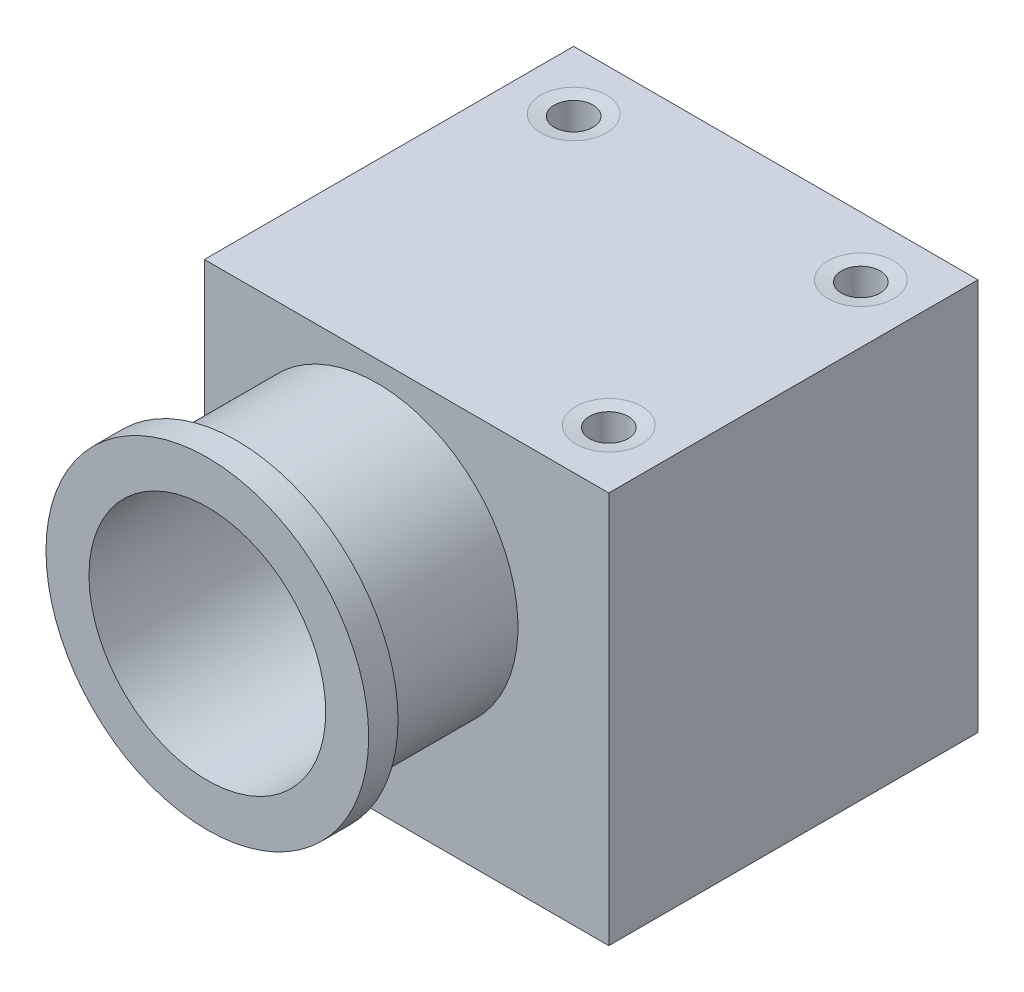
ISO-10303-21;
HEADER;
FILE_DESCRIPTION(('STEP AP214'),'2;1');
FILE_NAME('part.step','',(''),(''),'','','');
FILE_SCHEMA(('AUTOMOTIVE_DESIGN { 1 0 10303 214 1 1 1 1 }'));
ENDSEC;
DATA;
#1=APPLICATION_CONTEXT('core data for automotive mechanical design processes');
#2=APPLICATION_PROTOCOL_DEFINITION('international standard','automotive_design',2000,#1);
#3=PRODUCT_CONTEXT('',#1,'mechanical');
#4=PRODUCT('Part','Part','',(#3));
#5=PRODUCT_RELATED_PRODUCT_CATEGORY('part','',(#4));
#6=PRODUCT_DEFINITION_FORMATION('','',#4);
#7=PRODUCT_DEFINITION_CONTEXT('part definition',#1,'design');
#8=PRODUCT_DEFINITION('design','',#6,#7);
#9=PRODUCT_DEFINITION_SHAPE('','',#8);
#10=(LENGTH_UNIT() NAMED_UNIT(*) SI_UNIT(.MILLI.,.METRE.));
#11=(NAMED_UNIT(*) PLANE_ANGLE_UNIT() SI_UNIT($,.RADIAN.));
#12=(NAMED_UNIT(*) SI_UNIT($,.STERADIAN.) SOLID_ANGLE_UNIT());
#13=UNCERTAINTY_MEASURE_WITH_UNIT(LENGTH_MEASURE(1.E-05),#10,'distance_accuracy_value','');
#14=(GEOMETRIC_REPRESENTATION_CONTEXT(3) GLOBAL_UNCERTAINTY_ASSIGNED_CONTEXT((#13)) GLOBAL_UNIT_ASSIGNED_CONTEXT((#10,
#11,#12)) REPRESENTATION_CONTEXT('',''));
#15=CARTESIAN_POINT('',(0.,0.,0.));
#16=DIRECTION('',(0.,0.,1.));
#17=DIRECTION('',(1.,0.,0.));
#18=AXIS2_PLACEMENT_3D('',#15,#16,#17);
#19=CARTESIAN_POINT('',(-7.493,-8.49630000000001,-24.1554));
#20=DIRECTION('',(1.,0.,0.));
#21=DIRECTION('',(0.,0.,-1.));
#22=AXIS2_PLACEMENT_3D('',#19,#20,#21);
#23=PLANE('',#22);
#24=DIRECTION('',(0.,1.,0.));
#25=VECTOR('',#24,1.);
#26=CARTESIAN_POINT('',(-7.493,-8.49630000000001,-23.368));
#27=LINE('',#26,#25);
#28=CARTESIAN_POINT('',(-7.493,-8.49630000000001,-23.368));
#29=VERTEX_POINT('',#28);
#30=CARTESIAN_POINT('',(-7.493,8.49629999999999,-23.368));
#31=VERTEX_POINT('',#30);
#32=EDGE_CURVE('E125',#29,#31,#27,.T.);
#33=ORIENTED_EDGE('',*,*,#32,.F.);
#34=DIRECTION('',(0.,0.,1.));
#35=VECTOR('',#34,1.);
#36=CARTESIAN_POINT('',(-7.493,-8.49630000000001,-24.1554));
#37=LINE('',#36,#35);
#38=CARTESIAN_POINT('',(-7.493,-8.49630000000001,-7.366));
#39=VERTEX_POINT('',#38);
#40=EDGE_CURVE('E49',#29,#39,#37,.T.);
#41=ORIENTED_EDGE('',*,*,#40,.T.);
#42=DIRECTION('',(0.,-1.,0.));
#43=VECTOR('',#42,1.);
#44=CARTESIAN_POINT('',(-7.493,8.49629999999999,-7.366));
#45=LINE('',#44,#43);
#46=CARTESIAN_POINT('',(-7.493,8.49629999999999,-7.366));
#47=VERTEX_POINT('',#46);
#48=EDGE_CURVE('E89',#47,#39,#45,.T.);
#49=ORIENTED_EDGE('',*,*,#48,.F.);
#50=DIRECTION('',(0.,0.,1.));
#51=VECTOR('',#50,1.);
#52=CARTESIAN_POINT('',(-7.493,8.49629999999999,-24.1554));
#53=LINE('',#52,#51);
#54=EDGE_CURVE('E11',#31,#47,#53,.T.);
#55=ORIENTED_EDGE('',*,*,#54,.F.);
#56=EDGE_LOOP('',(#33,#41,#49,#55));
#57=FACE_BOUND('',#56,.T.);
#58=ADVANCED_FACE('F40',(#57),#23,.F.);
#59=CARTESIAN_POINT('',(-7.493,8.49629999999999,-24.1554));
#60=DIRECTION('',(0.,-1.,0.));
#61=DIRECTION('',(0.,0.,-1.));
#62=AXIS2_PLACEMENT_3D('',#59,#60,#61);
#63=PLANE('',#62);
#64=CARTESIAN_POINT('',(7.493,8.49629999999999,-9.906));
#65=DIRECTION('',(0.,1.,0.));
#66=DIRECTION('',(0.,0.,1.));
#67=AXIS2_PLACEMENT_3D('',#64,#65,#66);
#68=CIRCLE('',#67,1.4224);
#69=CARTESIAN_POINT('',(7.493,8.49629999999999,-8.4836));
#70=VERTEX_POINT('',#69);
#71=EDGE_CURVE('E201',#70,#70,#68,.T.);
#72=ORIENTED_EDGE('',*,*,#71,.F.);
#73=EDGE_LOOP('',(#72));
#74=FACE_BOUND('',#73,.T.);
#75=CARTESIAN_POINT('',(7.493,8.49629999999999,-20.828));
#76=DIRECTION('',(0.,1.,0.));
#77=DIRECTION('',(0.,0.,1.));
#78=AXIS2_PLACEMENT_3D('',#75,#76,#77);
#79=CIRCLE('',#78,1.4224);
#80=CARTESIAN_POINT('',(7.493,8.49629999999999,-19.4056));
#81=VERTEX_POINT('',#80);
#82=EDGE_CURVE('E190',#81,#81,#79,.T.);
#83=ORIENTED_EDGE('',*,*,#82,.F.);
#84=EDGE_LOOP('',(#83));
#85=FACE_BOUND('',#84,.T.);
#86=CARTESIAN_POINT('',(-4.953,8.49629999999999,-20.828));
#87=DIRECTION('',(0.,1.,0.));
#88=DIRECTION('',(0.,0.,1.));
#89=AXIS2_PLACEMENT_3D('',#86,#87,#88);
#90=CIRCLE('',#89,1.4224);
#91=CARTESIAN_POINT('',(-4.953,8.49629999999999,-19.4056));
#92=VERTEX_POINT('',#91);
#93=EDGE_CURVE('E118',#92,#92,#90,.T.);
#94=ORIENTED_EDGE('',*,*,#93,.F.);
#95=EDGE_LOOP('',(#94));
#96=FACE_BOUND('',#95,.T.);
#97=DIRECTION('',(1.,0.,0.));
#98=VECTOR('',#97,1.);
#99=CARTESIAN_POINT('',(-7.493,8.49629999999999,-23.368));
#100=LINE('',#99,#98);
#101=CARTESIAN_POINT('',(10.033,8.49629999999999,-23.368));
#102=VERTEX_POINT('',#101);
#103=EDGE_CURVE('E128',#31,#102,#100,.T.);
#104=ORIENTED_EDGE('',*,*,#103,.F.);
#105=ORIENTED_EDGE('',*,*,#54,.T.);
#106=DIRECTION('',(-1.,0.,0.));
#107=VECTOR('',#106,1.);
#108=CARTESIAN_POINT('',(-7.493,8.49629999999999,-7.366));
#109=LINE('',#108,#107);
#110=CARTESIAN_POINT('',(10.033,8.49629999999999,-7.366));
#111=VERTEX_POINT('',#110);
#112=EDGE_CURVE('E92',#111,#47,#109,.T.);
#113=ORIENTED_EDGE('',*,*,#112,.F.);
#114=DIRECTION('',(0.,0.,1.));
#115=VECTOR('',#114,1.);
#116=CARTESIAN_POINT('',(10.033,8.49629999999999,-7.366));
#117=LINE('',#116,#115);
#118=EDGE_CURVE('E107',#102,#111,#117,.T.);
#119=ORIENTED_EDGE('',*,*,#118,.F.);
#120=EDGE_LOOP('',(#104,#105,#113,#119));
#121=FACE_BOUND('',#120,.T.);
#122=ADVANCED_FACE('F210',(#74,#85,#96,#121),#63,.F.);
#123=CARTESIAN_POINT('',(-7.493,-8.49630000000001,-24.1554));
#124=DIRECTION('',(0.,-1.,0.));
#125=DIRECTION('',(0.,0.,-1.));
#126=AXIS2_PLACEMENT_3D('',#123,#124,#125);
#127=PLANE('',#126);
#128=CARTESIAN_POINT('',(7.493,-8.49630000000001,-9.906));
#129=DIRECTION('',(0.,-1.,0.));
#130=DIRECTION('',(0.,0.,-1.));
#131=AXIS2_PLACEMENT_3D('',#128,#129,#130);
#132=CIRCLE('',#131,0.838200000000001);
#133=CARTESIAN_POINT('',(7.493,-8.49630000000001,-10.7442));
#134=VERTEX_POINT('',#133);
#135=EDGE_CURVE('E180',#134,#134,#132,.T.);
#136=ORIENTED_EDGE('',*,*,#135,.F.);
#137=EDGE_LOOP('',(#136));
#138=FACE_BOUND('',#137,.T.);
#139=CARTESIAN_POINT('',(7.493,-8.49630000000001,-20.828));
#140=DIRECTION('',(0.,-1.,0.));
#141=DIRECTION('',(0.,0.,-1.));
#142=AXIS2_PLACEMENT_3D('',#139,#140,#141);
#143=CIRCLE('',#142,0.838200000000001);
#144=CARTESIAN_POINT('',(7.493,-8.49630000000001,-21.6662));
#145=VERTEX_POINT('',#144);
#146=EDGE_CURVE('E115',#145,#145,#143,.T.);
#147=ORIENTED_EDGE('',*,*,#146,.F.);
#148=EDGE_LOOP('',(#147));
#149=FACE_BOUND('',#148,.T.);
#150=CARTESIAN_POINT('',(-4.953,-8.49630000000001,-20.828));
#151=DIRECTION('',(0.,-1.,0.));
#152=DIRECTION('',(0.,0.,-1.));
#153=AXIS2_PLACEMENT_3D('',#150,#151,#152);
#154=CIRCLE('',#153,0.8382);
#155=CARTESIAN_POINT('',(-4.953,-8.49630000000001,-21.6662));
#156=VERTEX_POINT('',#155);
#157=EDGE_CURVE('E109',#156,#156,#154,.T.);
#158=ORIENTED_EDGE('',*,*,#157,.F.);
#159=EDGE_LOOP('',(#158));
#160=FACE_BOUND('',#159,.T.);
#161=ORIENTED_EDGE('',*,*,#40,.F.);
#162=DIRECTION('',(-1.,0.,0.));
#163=VECTOR('',#162,1.);
#164=CARTESIAN_POINT('',(-7.493,-8.49630000000001,-23.368));
#165=LINE('',#164,#163);
#166=CARTESIAN_POINT('',(10.033,-8.49630000000001,-23.368));
#167=VERTEX_POINT('',#166);
#168=EDGE_CURVE('E97',#167,#29,#165,.T.);
#169=ORIENTED_EDGE('',*,*,#168,.F.);
#170=DIRECTION('',(0.,0.,-1.));
#171=VECTOR('',#170,1.);
#172=CARTESIAN_POINT('',(10.033,-8.49630000000001,-7.366));
#173=LINE('',#172,#171);
#174=CARTESIAN_POINT('',(10.033,-8.49630000000001,-7.366));
#175=VERTEX_POINT('',#174);
#176=EDGE_CURVE('E95',#175,#167,#173,.T.);
#177=ORIENTED_EDGE('',*,*,#176,.F.);
#178=DIRECTION('',(1.,0.,0.));
#179=VECTOR('',#178,1.);
#180=CARTESIAN_POINT('',(-7.493,-8.49630000000001,-7.366));
#181=LINE('',#180,#179);
#182=EDGE_CURVE('E83',#39,#175,#181,.T.);
#183=ORIENTED_EDGE('',*,*,#182,.F.);
#184=EDGE_LOOP('',(#161,#169,#177,#183));
#185=FACE_BOUND('',#184,.T.);
#186=ADVANCED_FACE('F96',(#138,#149,#160,#185),#127,.T.);
#187=CARTESIAN_POINT('',(0.,1.50369999999999,-24.1554));
#188=DIRECTION('',(0.,0.,1.));
#189=DIRECTION('',(1.,0.,0.));
#190=AXIS2_PLACEMENT_3D('',#187,#188,#189);
#191=CYLINDRICAL_SURFACE('',#190,1.4224);
#192=CARTESIAN_POINT('',(0.,1.50369999999999,-19.558));
#193=DIRECTION('',(0.,0.,1.));
#194=DIRECTION('',(1.,0.,0.));
#195=AXIS2_PLACEMENT_3D('',#192,#193,#194);
#196=CIRCLE('',#195,1.4224);
#197=CARTESIAN_POINT('',(1.4224,1.50369999999999,-19.558));
#198=VERTEX_POINT('',#197);
#199=EDGE_CURVE('E166',#198,#198,#196,.F.);
#200=ORIENTED_EDGE('',*,*,#199,.F.);
#201=EDGE_LOOP('',(#200));
#202=FACE_BOUND('',#201,.T.);
#203=CARTESIAN_POINT('',(0.,1.50369999999999,-23.368));
#204=DIRECTION('',(0.,0.,-1.));
#205=DIRECTION('',(-1.,0.,0.));
#206=AXIS2_PLACEMENT_3D('',#203,#204,#205);
#207=CIRCLE('',#206,1.4224);
#208=CARTESIAN_POINT('',(-1.4224,1.50369999999999,-23.368));
#209=VERTEX_POINT('',#208);
#210=EDGE_CURVE('E133',#209,#209,#207,.F.);
#211=ORIENTED_EDGE('',*,*,#210,.F.);
#212=EDGE_LOOP('',(#211));
#213=FACE_BOUND('',#212,.T.);
#214=ADVANCED_FACE('F223',(#202,#213),#191,.F.);
#215=CARTESIAN_POINT('',(0.,0.,-7.366));
#216=DIRECTION('',(0.,0.,1.));
#217=DIRECTION('',(1.,0.,0.));
#218=AXIS2_PLACEMENT_3D('',#215,#216,#217);
#219=PLANE('',#218);
#220=ORIENTED_EDGE('',*,*,#48,.T.);
#221=ORIENTED_EDGE('',*,*,#182,.T.);
#222=DIRECTION('',(0.,-1.,0.));
#223=VECTOR('',#222,1.);
#224=CARTESIAN_POINT('',(10.033,8.49629999999999,-7.366));
#225=LINE('',#224,#223);
#226=EDGE_CURVE('E88',#111,#175,#225,.T.);
#227=ORIENTED_EDGE('',*,*,#226,.F.);
#228=ORIENTED_EDGE('',*,*,#112,.T.);
#229=EDGE_LOOP('',(#220,#221,#227,#228));
#230=FACE_BOUND('',#229,.T.);
#231=CARTESIAN_POINT('',(0.,1.50369999999999,-7.366));
#232=DIRECTION('',(0.,0.,1.));
#233=DIRECTION('',(1.,0.,0.));
#234=AXIS2_PLACEMENT_3D('',#231,#232,#233);
#235=CIRCLE('',#234,6.096);
#236=CARTESIAN_POINT('',(-6.096,1.50369999999999,-7.366));
#237=VERTEX_POINT('',#236);
#238=EDGE_CURVE('E143',#237,#237,#235,.T.);
#239=ORIENTED_EDGE('',*,*,#238,.F.);
#240=EDGE_LOOP('',(#239));
#241=FACE_BOUND('',#240,.T.);
#242=ADVANCED_FACE('F85',(#230,#241),#219,.T.);
#243=CARTESIAN_POINT('',(0.,1.50369999999999,-18.288));
#244=DIRECTION('',(0.,0.,1.));
#245=DIRECTION('',(1.,0.,0.));
#246=AXIS2_PLACEMENT_3D('',#243,#244,#245);
#247=CYLINDRICAL_SURFACE('',#246,5.1308);
#248=CARTESIAN_POINT('',(0.,1.50369999999999,-18.288));
#249=DIRECTION('',(0.,0.,1.));
#250=DIRECTION('',(1.,0.,0.));
#251=AXIS2_PLACEMENT_3D('',#248,#249,#250);
#252=CIRCLE('',#251,5.1308);
#253=CARTESIAN_POINT('',(5.1308,1.50369999999999,-18.288));
#254=VERTEX_POINT('',#253);
#255=EDGE_CURVE('E157',#254,#254,#252,.T.);
#256=ORIENTED_EDGE('',*,*,#255,.F.);
#257=EDGE_LOOP('',(#256));
#258=FACE_BOUND('',#257,.T.);
#259=CARTESIAN_POINT('',(0.,1.50369999999999,0.));
#260=DIRECTION('',(0.,0.,1.));
#261=DIRECTION('',(1.,0.,0.));
#262=AXIS2_PLACEMENT_3D('',#259,#260,#261);
#263=CIRCLE('',#262,5.1308);
#264=CARTESIAN_POINT('',(5.1308,1.50369999999999,0.));
#265=VERTEX_POINT('',#264);
#266=EDGE_CURVE('E134',#265,#265,#263,.T.);
#267=ORIENTED_EDGE('',*,*,#266,.T.);
#268=EDGE_LOOP('',(#267));
#269=FACE_BOUND('',#268,.T.);
#270=ADVANCED_FACE('F231',(#258,#269),#247,.F.);
#271=CARTESIAN_POINT('',(0.,1.50369999999999,-19.558));
#272=DIRECTION('',(0.,0.,1.));
#273=DIRECTION('',(1.,0.,0.));
#274=AXIS2_PLACEMENT_3D('',#271,#272,#273);
#275=CYLINDRICAL_SURFACE('',#274,3.2639);
#276=CARTESIAN_POINT('',(0.,1.50369999999999,-19.558));
#277=DIRECTION('',(0.,0.,1.));
#278=DIRECTION('',(1.,0.,0.));
#279=AXIS2_PLACEMENT_3D('',#276,#277,#278);
#280=CIRCLE('',#279,3.2639);
#281=CARTESIAN_POINT('',(3.2639,1.50369999999999,-19.558));
#282=VERTEX_POINT('',#281);
#283=EDGE_CURVE('E162',#282,#282,#280,.T.);
#284=ORIENTED_EDGE('',*,*,#283,.F.);
#285=EDGE_LOOP('',(#284));
#286=FACE_BOUND('',#285,.T.);
#287=CARTESIAN_POINT('',(0.,1.50369999999999,-18.288));
#288=DIRECTION('',(0.,0.,1.));
#289=DIRECTION('',(1.,0.,0.));
#290=AXIS2_PLACEMENT_3D('',#287,#288,#289);
#291=CIRCLE('',#290,3.2639);
#292=CARTESIAN_POINT('',(3.2639,1.50369999999999,-18.288));
#293=VERTEX_POINT('',#292);
#294=EDGE_CURVE('E161',#293,#293,#291,.F.);
#295=ORIENTED_EDGE('',*,*,#294,.F.);
#296=EDGE_LOOP('',(#295));
#297=FACE_BOUND('',#296,.T.);
#298=ADVANCED_FACE('F263',(#286,#297),#275,.F.);
#299=CARTESIAN_POINT('',(0.,1.50369999999999,-19.558));
#300=DIRECTION('',(0.,0.,1.));
#301=DIRECTION('',(1.,0.,0.));
#302=AXIS2_PLACEMENT_3D('',#299,#300,#301);
#303=PLANE('',#302);
#304=ORIENTED_EDGE('',*,*,#283,.T.);
#305=EDGE_LOOP('',(#304));
#306=FACE_BOUND('',#305,.T.);
#307=ORIENTED_EDGE('',*,*,#199,.T.);
#308=EDGE_LOOP('',(#307));
#309=FACE_BOUND('',#308,.T.);
#310=ADVANCED_FACE('F274',(#306,#309),#303,.T.);
#311=CARTESIAN_POINT('',(0.,1.50369999999999,-18.288));
#312=DIRECTION('',(0.,0.,1.));
#313=DIRECTION('',(1.,0.,0.));
#314=AXIS2_PLACEMENT_3D('',#311,#312,#313);
#315=PLANE('',#314);
#316=ORIENTED_EDGE('',*,*,#255,.T.);
#317=EDGE_LOOP('',(#316));
#318=FACE_BOUND('',#317,.T.);
#319=ORIENTED_EDGE('',*,*,#294,.T.);
#320=EDGE_LOOP('',(#319));
#321=FACE_BOUND('',#320,.T.);
#322=ADVANCED_FACE('F283',(#318,#321),#315,.T.);
#323=CARTESIAN_POINT('',(0.,1.50369999999999,-1.27));
#324=DIRECTION('',(0.,0.,-1.));
#325=DIRECTION('',(-1.,0.,0.));
#326=AXIS2_PLACEMENT_3D('',#323,#324,#325);
#327=CYLINDRICAL_SURFACE('',#326,6.096);
#328=CARTESIAN_POINT('',(0.,1.50369999999999,-1.27));
#329=DIRECTION('',(0.,0.,1.));
#330=DIRECTION('',(1.,0.,0.));
#331=AXIS2_PLACEMENT_3D('',#328,#329,#330);
#332=CIRCLE('',#331,6.096);
#333=CARTESIAN_POINT('',(-6.096,1.50369999999999,-1.27));
#334=VERTEX_POINT('',#333);
#335=EDGE_CURVE('E147',#334,#334,#332,.T.);
#336=CARTESIAN_POINT('',(-6.096,1.50369999999999,-1.27));
#337=CARTESIAN_POINT('',(-6.096,1.50369999999999,-1.3335));
#338=CARTESIAN_POINT('',(-6.096,1.50369999999999,-1.397));
#339=CARTESIAN_POINT('',(-6.096,1.50369999999999,-1.524));
#340=CARTESIAN_POINT('',(-6.096,1.50369999999999,-1.5875));
#341=CARTESIAN_POINT('',(-6.096,1.50369999999999,-1.7145));
#342=CARTESIAN_POINT('',(-6.096,1.50369999999999,-1.778));
#343=CARTESIAN_POINT('',(-6.096,1.50369999999999,-1.905));
#344=CARTESIAN_POINT('',(-6.096,1.50369999999999,-1.9685));
#345=CARTESIAN_POINT('',(-6.096,1.50369999999999,-2.0955));
#346=CARTESIAN_POINT('',(-6.096,1.50369999999999,-2.159));
#347=CARTESIAN_POINT('',(-6.096,1.50369999999999,-2.286));
#348=CARTESIAN_POINT('',(-6.096,1.50369999999999,-2.3495));
#349=CARTESIAN_POINT('',(-6.096,1.50369999999999,-2.4765));
#350=CARTESIAN_POINT('',(-6.096,1.50369999999999,-2.54));
#351=CARTESIAN_POINT('',(-6.096,1.50369999999999,-2.667));
#352=CARTESIAN_POINT('',(-6.096,1.50369999999999,-2.7305));
#353=CARTESIAN_POINT('',(-6.096,1.50369999999999,-2.8575));
#354=CARTESIAN_POINT('',(-6.096,1.50369999999999,-2.921));
#355=CARTESIAN_POINT('',(-6.096,1.50369999999999,-3.048));
#356=CARTESIAN_POINT('',(-6.096,1.50369999999999,-3.1115));
#357=CARTESIAN_POINT('',(-6.096,1.50369999999999,-3.2385));
#358=CARTESIAN_POINT('',(-6.096,1.50369999999999,-3.302));
#359=CARTESIAN_POINT('',(-6.096,1.50369999999999,-3.429));
#360=CARTESIAN_POINT('',(-6.096,1.50369999999999,-3.4925));
#361=CARTESIAN_POINT('',(-6.096,1.50369999999999,-3.6195));
#362=CARTESIAN_POINT('',(-6.096,1.50369999999999,-3.683));
#363=CARTESIAN_POINT('',(-6.096,1.50369999999999,-3.81));
#364=CARTESIAN_POINT('',(-6.096,1.50369999999999,-3.8735));
#365=CARTESIAN_POINT('',(-6.096,1.50369999999999,-4.0005));
#366=CARTESIAN_POINT('',(-6.096,1.50369999999999,-4.064));
#367=CARTESIAN_POINT('',(-6.096,1.50369999999999,-4.191));
#368=CARTESIAN_POINT('',(-6.096,1.50369999999999,-4.2545));
#369=CARTESIAN_POINT('',(-6.096,1.50369999999999,-4.3815));
#370=CARTESIAN_POINT('',(-6.096,1.50369999999999,-4.445));
#371=CARTESIAN_POINT('',(-6.096,1.50369999999999,-4.572));
#372=CARTESIAN_POINT('',(-6.096,1.50369999999999,-4.6355));
#373=CARTESIAN_POINT('',(-6.096,1.50369999999999,-4.7625));
#374=CARTESIAN_POINT('',(-6.096,1.50369999999999,-4.826));
#375=CARTESIAN_POINT('',(-6.096,1.50369999999999,-4.953));
#376=CARTESIAN_POINT('',(-6.096,1.50369999999999,-5.0165));
#377=CARTESIAN_POINT('',(-6.096,1.50369999999999,-5.1435));
#378=CARTESIAN_POINT('',(-6.096,1.50369999999999,-5.207));
#379=CARTESIAN_POINT('',(-6.096,1.50369999999999,-5.334));
#380=CARTESIAN_POINT('',(-6.096,1.50369999999999,-5.3975));
#381=CARTESIAN_POINT('',(-6.096,1.50369999999999,-5.5245));
#382=CARTESIAN_POINT('',(-6.096,1.50369999999999,-5.588));
#383=CARTESIAN_POINT('',(-6.096,1.50369999999999,-5.715));
#384=CARTESIAN_POINT('',(-6.096,1.50369999999999,-5.7785));
#385=CARTESIAN_POINT('',(-6.096,1.50369999999999,-5.9055));
#386=CARTESIAN_POINT('',(-6.096,1.50369999999999,-5.969));
#387=CARTESIAN_POINT('',(-6.096,1.50369999999999,-6.096));
#388=CARTESIAN_POINT('',(-6.096,1.50369999999999,-6.1595));
#389=CARTESIAN_POINT('',(-6.096,1.50369999999999,-6.2865));
#390=CARTESIAN_POINT('',(-6.096,1.50369999999999,-6.35));
#391=CARTESIAN_POINT('',(-6.096,1.50369999999999,-6.477));
#392=CARTESIAN_POINT('',(-6.096,1.50369999999999,-6.5405));
#393=CARTESIAN_POINT('',(-6.096,1.50369999999999,-6.6675));
#394=CARTESIAN_POINT('',(-6.096,1.50369999999999,-6.731));
#395=CARTESIAN_POINT('',(-6.096,1.50369999999999,-6.858));
#396=CARTESIAN_POINT('',(-6.096,1.50369999999999,-6.9215));
#397=CARTESIAN_POINT('',(-6.096,1.50369999999999,-7.0485));
#398=CARTESIAN_POINT('',(-6.096,1.50369999999999,-7.112));
#399=CARTESIAN_POINT('',(-6.096,1.50369999999999,-7.239));
#400=CARTESIAN_POINT('',(-6.096,1.50369999999999,-7.3025));
#401=CARTESIAN_POINT('',(-6.096,1.50369999999999,-7.366));
#402=B_SPLINE_CURVE_WITH_KNOTS('',3,(#336,#337,#338,#339,#340,#341,#342,#343,#344,#345,#346,
#347,#348,#349,#350,#351,#352,#353,#354,#355,#356,#357,#358,#359,#360,#361,#362,#363,#364,#365,
#366,#367,#368,#369,#370,#371,#372,#373,#374,#375,#376,#377,#378,#379,#380,#381,#382,#383,#384,
#385,#386,#387,#388,#389,#390,#391,#392,#393,#394,#395,#396,#397,#398,#399,#400,#401),
.UNSPECIFIED.,.F.,.F.,(4,2,2,2,2,2,2,2,2,2,2,2,2,2,2,2,2,2,2,2,2,2,2,2,2,2,2,2,2,2,2,2,4),(0.,
0.1905,0.381,0.5715,0.762,0.9525,1.143,1.3335,1.524,1.7145,1.905,2.0955,2.286,2.4765,2.667,
2.8575,3.048,3.2385,3.429,3.6195,3.81,4.0005,4.191,4.3815,4.572,4.7625,4.953,5.1435,5.334,
5.5245,5.715,5.9055,6.096),.UNSPECIFIED.);
#403=EDGE_CURVE('BSEAM291',#334,#237,#402,.T.);
#404=ORIENTED_EDGE('',*,*,#335,.F.);
#405=ORIENTED_EDGE('',*,*,#238,.T.);
#406=ORIENTED_EDGE('',*,*,#403,.T.);
#407=ORIENTED_EDGE('',*,*,#403,.F.);
#408=EDGE_LOOP('',(#404,#406,#405,#407));
#409=FACE_BOUND('',#408,.T.);
#410=ADVANCED_FACE('F291',(#409),#327,.T.);
#411=CARTESIAN_POINT('',(0.,1.50369999999999,-1.27));
#412=DIRECTION('',(0.,0.,1.));
#413=DIRECTION('',(1.,0.,0.));
#414=AXIS2_PLACEMENT_3D('',#411,#412,#413);
#415=PLANE('',#414);
#416=CARTESIAN_POINT('',(0.,1.50369999999999,-1.27));
#417=DIRECTION('',(0.,0.,1.));
#418=DIRECTION('',(1.,0.,0.));
#419=AXIS2_PLACEMENT_3D('',#416,#417,#418);
#420=CIRCLE('',#419,6.9926);
#421=CARTESIAN_POINT('',(6.9926,1.50369999999999,-1.27));
#422=VERTEX_POINT('',#421);
#423=EDGE_CURVE('E138',#422,#422,#420,.T.);
#424=ORIENTED_EDGE('',*,*,#423,.F.);
#425=EDGE_LOOP('',(#424));
#426=FACE_BOUND('',#425,.T.);
#427=ORIENTED_EDGE('',*,*,#335,.T.);
#428=EDGE_LOOP('',(#427));
#429=FACE_BOUND('',#428,.T.);
#430=ADVANCED_FACE('F299',(#426,#429),#415,.F.);
#431=CARTESIAN_POINT('',(0.,1.50369999999999,0.));
#432=DIRECTION('',(0.,0.,1.));
#433=DIRECTION('',(1.,0.,0.));
#434=AXIS2_PLACEMENT_3D('',#431,#432,#433);
#435=PLANE('',#434);
#436=CARTESIAN_POINT('',(0.,1.50369999999999,0.));
#437=DIRECTION('',(0.,0.,1.));
#438=DIRECTION('',(1.,0.,0.));
#439=AXIS2_PLACEMENT_3D('',#436,#437,#438);
#440=CIRCLE('',#439,6.9926);
#441=CARTESIAN_POINT('',(6.9926,1.50369999999999,0.));
#442=VERTEX_POINT('',#441);
#443=EDGE_CURVE('E139',#442,#442,#440,.T.);
#444=ORIENTED_EDGE('',*,*,#443,.T.);
#445=EDGE_LOOP('',(#444));
#446=FACE_BOUND('',#445,.T.);
#447=ORIENTED_EDGE('',*,*,#266,.F.);
#448=EDGE_LOOP('',(#447));
#449=FACE_BOUND('',#448,.T.);
#450=ADVANCED_FACE('F307',(#446,#449),#435,.T.);
#451=CARTESIAN_POINT('',(0.,1.50369999999999,0.));
#452=DIRECTION('',(0.,0.,-1.));
#453=DIRECTION('',(-1.,0.,0.));
#454=AXIS2_PLACEMENT_3D('',#451,#452,#453);
#455=CYLINDRICAL_SURFACE('',#454,6.9926);
#456=ORIENTED_EDGE('',*,*,#443,.F.);
#457=EDGE_LOOP('',(#456));
#458=FACE_BOUND('',#457,.T.);
#459=ORIENTED_EDGE('',*,*,#423,.T.);
#460=EDGE_LOOP('',(#459));
#461=FACE_BOUND('',#460,.T.);
#462=ADVANCED_FACE('F219',(#458,#461),#455,.T.);
#463=CARTESIAN_POINT('',(0.,0.,-23.368));
#464=DIRECTION('',(0.,0.,-1.));
#465=DIRECTION('',(-1.,0.,0.));
#466=AXIS2_PLACEMENT_3D('',#463,#464,#465);
#467=PLANE('',#466);
#468=ORIENTED_EDGE('',*,*,#32,.T.);
#469=ORIENTED_EDGE('',*,*,#103,.T.);
#470=DIRECTION('',(0.,1.,0.));
#471=VECTOR('',#470,1.);
#472=CARTESIAN_POINT('',(10.033,8.49629999999999,-23.368));
#473=LINE('',#472,#471);
#474=EDGE_CURVE('E102',#167,#102,#473,.T.);
#475=ORIENTED_EDGE('',*,*,#474,.F.);
#476=ORIENTED_EDGE('',*,*,#168,.T.);
#477=EDGE_LOOP('',(#468,#469,#475,#476));
#478=FACE_BOUND('',#477,.T.);
#479=ORIENTED_EDGE('',*,*,#210,.T.);
#480=EDGE_LOOP('',(#479));
#481=FACE_BOUND('',#480,.T.);
#482=ADVANCED_FACE('F216',(#478,#481),#467,.T.);
#483=CARTESIAN_POINT('',(10.033,0.,0.));
#484=DIRECTION('',(1.,0.,0.));
#485=DIRECTION('',(0.,0.,-1.));
#486=AXIS2_PLACEMENT_3D('',#483,#484,#485);
#487=PLANE('',#486);
#488=ORIENTED_EDGE('',*,*,#226,.T.);
#489=ORIENTED_EDGE('',*,*,#176,.T.);
#490=ORIENTED_EDGE('',*,*,#474,.T.);
#491=ORIENTED_EDGE('',*,*,#118,.T.);
#492=EDGE_LOOP('',(#488,#489,#490,#491));
#493=FACE_BOUND('',#492,.T.);
#494=ADVANCED_FACE('F105',(#493),#487,.T.);
#495=CARTESIAN_POINT('',(-4.953,-11.8237,-20.828));
#496=DIRECTION('',(0.,1.,0.));
#497=DIRECTION('',(0.,0.,1.));
#498=AXIS2_PLACEMENT_3D('',#495,#496,#497);
#499=CYLINDRICAL_SURFACE('',#498,0.8382);
#500=CARTESIAN_POINT('',(-4.953,8.41419604436686,-20.828));
#501=DIRECTION('',(0.,1.,0.));
#502=DIRECTION('',(0.,0.,1.));
#503=AXIS2_PLACEMENT_3D('',#500,#501,#502);
#504=CIRCLE('',#503,0.8382);
#505=CARTESIAN_POINT('',(-4.953,8.41419604436686,-19.9898));
#506=VERTEX_POINT('',#505);
#507=EDGE_CURVE('E184',#506,#506,#504,.T.);
#508=ORIENTED_EDGE('',*,*,#507,.T.);
#509=EDGE_LOOP('',(#508));
#510=FACE_BOUND('',#509,.T.);
#511=ORIENTED_EDGE('',*,*,#157,.T.);
#512=EDGE_LOOP('',(#511));
#513=FACE_BOUND('',#512,.T.);
#514=ADVANCED_FACE('F335',(#510,#513),#499,.F.);
#515=CARTESIAN_POINT('',(7.493,-11.8237,-20.828));
#516=DIRECTION('',(0.,1.,0.));
#517=DIRECTION('',(0.,0.,1.));
#518=AXIS2_PLACEMENT_3D('',#515,#516,#517);
#519=CYLINDRICAL_SURFACE('',#518,0.838200000000001);
#520=CARTESIAN_POINT('',(7.493,8.41419604436686,-20.828));
#521=DIRECTION('',(0.,1.,0.));
#522=DIRECTION('',(0.,0.,1.));
#523=AXIS2_PLACEMENT_3D('',#520,#521,#522);
#524=CIRCLE('',#523,0.838200000000001);
#525=CARTESIAN_POINT('',(7.493,8.41419604436686,-19.9898));
#526=VERTEX_POINT('',#525);
#527=EDGE_CURVE('E187',#526,#526,#524,.T.);
#528=ORIENTED_EDGE('',*,*,#527,.T.);
#529=EDGE_LOOP('',(#528));
#530=FACE_BOUND('',#529,.T.);
#531=ORIENTED_EDGE('',*,*,#146,.T.);
#532=EDGE_LOOP('',(#531));
#533=FACE_BOUND('',#532,.T.);
#534=ADVANCED_FACE('F343',(#530,#533),#519,.F.);
#535=CARTESIAN_POINT('',(7.493,-11.8237,-9.906));
#536=DIRECTION('',(0.,1.,0.));
#537=DIRECTION('',(0.,0.,1.));
#538=AXIS2_PLACEMENT_3D('',#535,#536,#537);
#539=CYLINDRICAL_SURFACE('',#538,0.838200000000001);
#540=CARTESIAN_POINT('',(7.493,8.41419604436686,-9.906));
#541=DIRECTION('',(0.,1.,0.));
#542=DIRECTION('',(0.,0.,1.));
#543=AXIS2_PLACEMENT_3D('',#540,#541,#542);
#544=CIRCLE('',#543,0.838200000000001);
#545=CARTESIAN_POINT('',(7.493,8.41419604436686,-9.0678));
#546=VERTEX_POINT('',#545);
#547=EDGE_CURVE('E43',#546,#546,#544,.T.);
#548=ORIENTED_EDGE('',*,*,#547,.T.);
#549=EDGE_LOOP('',(#548));
#550=FACE_BOUND('',#549,.T.);
#551=ORIENTED_EDGE('',*,*,#135,.T.);
#552=EDGE_LOOP('',(#551));
#553=FACE_BOUND('',#552,.T.);
#554=ADVANCED_FACE('F352',(#550,#553),#539,.F.);
#555=CARTESIAN_POINT('',(-4.953,8.49629999999999,-20.828));
#556=DIRECTION('',(0.,1.,0.));
#557=DIRECTION('',(0.,0.,1.));
#558=AXIS2_PLACEMENT_3D('',#555,#556,#557);
#559=CONICAL_SURFACE('',#558,1.4224,1.43116998663535);
#560=ORIENTED_EDGE('',*,*,#93,.T.);
#561=EDGE_LOOP('',(#560));
#562=FACE_BOUND('',#561,.T.);
#563=ORIENTED_EDGE('',*,*,#507,.F.);
#564=EDGE_LOOP('',(#563));
#565=FACE_BOUND('',#564,.T.);
#566=ADVANCED_FACE('F360',(#562,#565),#559,.F.);
#567=CARTESIAN_POINT('',(7.493,8.49629999999999,-20.828));
#568=DIRECTION('',(0.,1.,0.));
#569=DIRECTION('',(0.,0.,1.));
#570=AXIS2_PLACEMENT_3D('',#567,#568,#569);
#571=CONICAL_SURFACE('',#570,1.4224,1.43116998663535);
#572=ORIENTED_EDGE('',*,*,#82,.T.);
#573=EDGE_LOOP('',(#572));
#574=FACE_BOUND('',#573,.T.);
#575=ORIENTED_EDGE('',*,*,#527,.F.);
#576=EDGE_LOOP('',(#575));
#577=FACE_BOUND('',#576,.T.);
#578=ADVANCED_FACE('F369',(#574,#577),#571,.F.);
#579=CARTESIAN_POINT('',(7.493,8.49629999999999,-9.906));
#580=DIRECTION('',(0.,1.,0.));
#581=DIRECTION('',(0.,0.,1.));
#582=AXIS2_PLACEMENT_3D('',#579,#580,#581);
#583=CONICAL_SURFACE('',#582,1.4224,1.43116998663535);
#584=ORIENTED_EDGE('',*,*,#71,.T.);
#585=EDGE_LOOP('',(#584));
#586=FACE_BOUND('',#585,.T.);
#587=ORIENTED_EDGE('',*,*,#547,.F.);
#588=EDGE_LOOP('',(#587));
#589=FACE_BOUND('',#588,.T.);
#590=ADVANCED_FACE('F207',(#586,#589),#583,.F.);
#591=CLOSED_SHELL('',(#58,#122,#186,#214,#242,#270,#298,#310,#322,#410,#430,#450,#462,#482,#494,
#514,#534,#554,#566,#578,#590));
#592=MANIFOLD_SOLID_BREP('B2',#591);
#593=ADVANCED_BREP_SHAPE_REPRESENTATION('',(#18,#592),#14);
#594=SHAPE_DEFINITION_REPRESENTATION(#9,#593);
ENDSEC;
END-ISO-10303-21;
